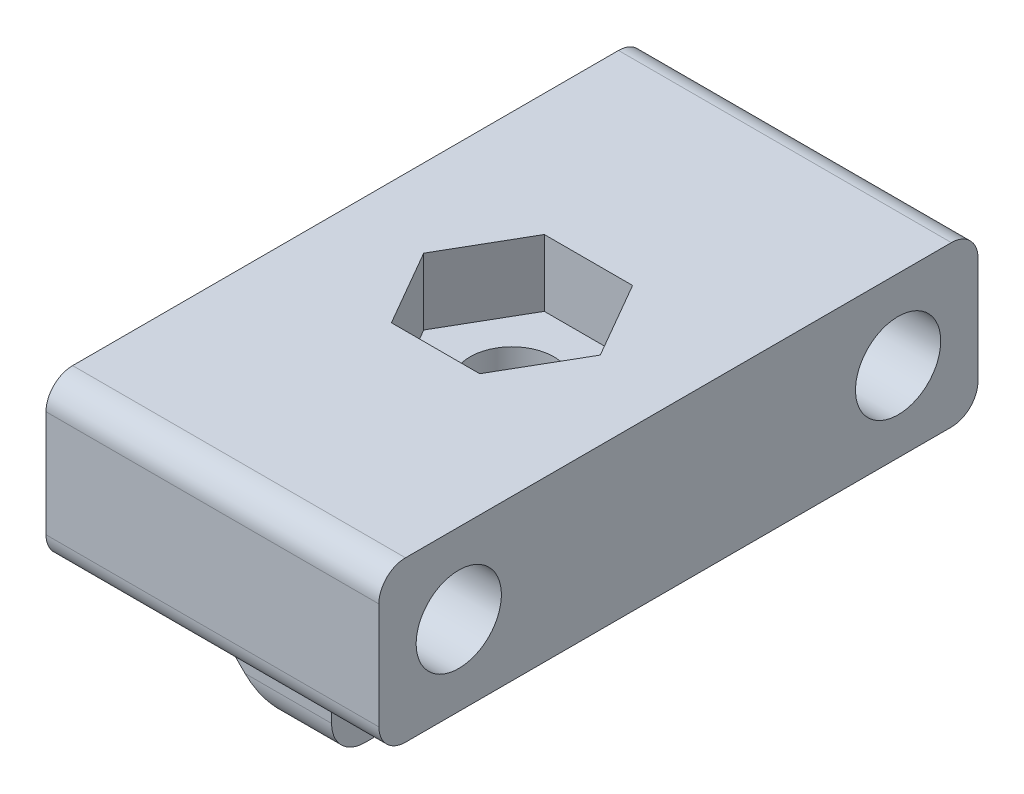
ISO-10303-21;
HEADER;
FILE_DESCRIPTION(('STEP AP214'),'2;1');
FILE_NAME('part.step','',(''),(''),'','','');
FILE_SCHEMA(('AUTOMOTIVE_DESIGN { 1 0 10303 214 1 1 1 1 }'));
ENDSEC;
DATA;
#1=APPLICATION_CONTEXT('core data for automotive mechanical design processes');
#2=APPLICATION_PROTOCOL_DEFINITION('international standard','automotive_design',2000,#1);
#3=PRODUCT_CONTEXT('',#1,'mechanical');
#4=PRODUCT('Part','Part','',(#3));
#5=PRODUCT_RELATED_PRODUCT_CATEGORY('part','',(#4));
#6=PRODUCT_DEFINITION_FORMATION('','',#4);
#7=PRODUCT_DEFINITION_CONTEXT('part definition',#1,'design');
#8=PRODUCT_DEFINITION('design','',#6,#7);
#9=PRODUCT_DEFINITION_SHAPE('','',#8);
#10=(LENGTH_UNIT() NAMED_UNIT(*) SI_UNIT(.MILLI.,.METRE.));
#11=(NAMED_UNIT(*) PLANE_ANGLE_UNIT() SI_UNIT($,.RADIAN.));
#12=(NAMED_UNIT(*) SI_UNIT($,.STERADIAN.) SOLID_ANGLE_UNIT());
#13=UNCERTAINTY_MEASURE_WITH_UNIT(LENGTH_MEASURE(1.E-05),#10,'distance_accuracy_value','');
#14=(GEOMETRIC_REPRESENTATION_CONTEXT(3) GLOBAL_UNCERTAINTY_ASSIGNED_CONTEXT((#13)) GLOBAL_UNIT_ASSIGNED_CONTEXT((#10,
#11,#12)) REPRESENTATION_CONTEXT('',''));
#15=CARTESIAN_POINT('',(0.,0.,0.));
#16=DIRECTION('',(0.,0.,1.));
#17=DIRECTION('',(1.,0.,0.));
#18=AXIS2_PLACEMENT_3D('',#15,#16,#17);
#19=CARTESIAN_POINT('',(0.,0.,0.));
#20=DIRECTION('',(0.,1.,0.));
#21=DIRECTION('',(0.,0.,1.));
#22=AXIS2_PLACEMENT_3D('',#19,#20,#21);
#23=PLANE('',#22);
#24=DIRECTION('',(0.,0.,-1.));
#25=VECTOR('',#24,1.);
#26=CARTESIAN_POINT('',(12.5,0.,22.5));
#27=LINE('',#26,#25);
#28=CARTESIAN_POINT('',(12.5,0.,20.5));
#29=VERTEX_POINT('',#28);
#30=CARTESIAN_POINT('',(12.5,0.,-20.5));
#31=VERTEX_POINT('',#30);
#32=EDGE_CURVE('E352',#29,#31,#27,.T.);
#33=ORIENTED_EDGE('',*,*,#32,.F.);
#34=DIRECTION('',(1.,0.,0.));
#35=VECTOR('',#34,1.);
#36=CARTESIAN_POINT('',(0.,0.,20.5));
#37=LINE('',#36,#35);
#38=CARTESIAN_POINT('',(-12.5,0.,20.5));
#39=VERTEX_POINT('',#38);
#40=EDGE_CURVE('E400',#29,#39,#37,.F.);
#41=ORIENTED_EDGE('',*,*,#40,.T.);
#42=DIRECTION('',(0.,0.,1.));
#43=VECTOR('',#42,1.);
#44=CARTESIAN_POINT('',(-12.5,0.,22.5));
#45=LINE('',#44,#43);
#46=CARTESIAN_POINT('',(-12.5,0.,-20.5));
#47=VERTEX_POINT('',#46);
#48=EDGE_CURVE('E337',#47,#39,#45,.T.);
#49=ORIENTED_EDGE('',*,*,#48,.F.);
#50=DIRECTION('',(-1.,0.,0.));
#51=VECTOR('',#50,1.);
#52=CARTESIAN_POINT('',(0.,0.,-20.5));
#53=LINE('',#52,#51);
#54=EDGE_CURVE('E398',#47,#31,#53,.F.);
#55=ORIENTED_EDGE('',*,*,#54,.T.);
#56=EDGE_LOOP('',(#33,#41,#49,#55));
#57=FACE_BOUND('',#56,.T.);
#58=DIRECTION('',(0.,0.,1.));
#59=VECTOR('',#58,1.);
#60=CARTESIAN_POINT('',(4.99999999999996,0.,18.5499398129865));
#61=LINE('',#60,#59);
#62=CARTESIAN_POINT('',(4.99999999999996,0.,-19.5499398129865));
#63=VERTEX_POINT('',#62);
#64=CARTESIAN_POINT('',(4.99999999999996,0.,19.5499398129865));
#65=VERTEX_POINT('',#64);
#66=EDGE_CURVE('E271',#63,#65,#61,.T.);
#67=ORIENTED_EDGE('',*,*,#66,.F.);
#68=DIRECTION('',(1.,0.,0.));
#69=VECTOR('',#68,1.);
#70=CARTESIAN_POINT('',(-4.99999999999996,0.,-19.5499398129865));
#71=LINE('',#70,#69);
#72=CARTESIAN_POINT('',(-4.99999999999996,0.,-19.5499398129865));
#73=VERTEX_POINT('',#72);
#74=EDGE_CURVE('E253',#63,#73,#71,.F.);
#75=ORIENTED_EDGE('',*,*,#74,.T.);
#76=DIRECTION('',(0.,0.,-1.));
#77=VECTOR('',#76,1.);
#78=CARTESIAN_POINT('',(-4.99999999999996,0.,18.5499398129865));
#79=LINE('',#78,#77);
#80=CARTESIAN_POINT('',(-4.99999999999996,0.,19.5499398129865));
#81=VERTEX_POINT('',#80);
#82=EDGE_CURVE('E212',#81,#73,#79,.T.);
#83=ORIENTED_EDGE('',*,*,#82,.F.);
#84=DIRECTION('',(-1.,0.,0.));
#85=VECTOR('',#84,1.);
#86=CARTESIAN_POINT('',(4.99999999999996,0.,19.5499398129865));
#87=LINE('',#86,#85);
#88=EDGE_CURVE('E250',#81,#65,#87,.F.);
#89=ORIENTED_EDGE('',*,*,#88,.T.);
#90=EDGE_LOOP('',(#67,#75,#83,#89));
#91=FACE_BOUND('',#90,.T.);
#92=ADVANCED_FACE('F49',(#57,#91),#23,.F.);
#93=CARTESIAN_POINT('',(-12.5,12.,22.5));
#94=DIRECTION('',(1.,0.,0.));
#95=DIRECTION('',(0.,0.,-1.));
#96=AXIS2_PLACEMENT_3D('',#93,#94,#95);
#97=PLANE('',#96);
#98=CARTESIAN_POINT('',(-12.5,6.,-16.5));
#99=DIRECTION('',(1.,0.,0.));
#100=DIRECTION('',(0.,0.,-1.));
#101=AXIS2_PLACEMENT_3D('',#98,#99,#100);
#102=CIRCLE('',#101,3.2);
#103=CARTESIAN_POINT('',(-12.5,6.,-19.7));
#104=VERTEX_POINT('',#103);
#105=EDGE_CURVE('E284',#104,#104,#102,.T.);
#106=ORIENTED_EDGE('',*,*,#105,.T.);
#107=EDGE_LOOP('',(#106));
#108=FACE_BOUND('',#107,.T.);
#109=CARTESIAN_POINT('',(-12.5,6.,16.5));
#110=DIRECTION('',(-1.,0.,0.));
#111=DIRECTION('',(0.,0.,1.));
#112=AXIS2_PLACEMENT_3D('',#109,#110,#111);
#113=CIRCLE('',#112,3.2);
#114=CARTESIAN_POINT('',(-12.5,6.,19.7));
#115=VERTEX_POINT('',#114);
#116=EDGE_CURVE('E288',#115,#115,#113,.T.);
#117=ORIENTED_EDGE('',*,*,#116,.F.);
#118=EDGE_LOOP('',(#117));
#119=FACE_BOUND('',#118,.T.);
#120=DIRECTION('',(0.,-1.,0.));
#121=VECTOR('',#120,1.);
#122=CARTESIAN_POINT('',(-12.5,12.,22.5));
#123=LINE('',#122,#121);
#124=CARTESIAN_POINT('',(-12.5,10.,22.5));
#125=VERTEX_POINT('',#124);
#126=CARTESIAN_POINT('',(-12.5,2.,22.5));
#127=VERTEX_POINT('',#126);
#128=EDGE_CURVE('E368',#125,#127,#123,.T.);
#129=ORIENTED_EDGE('',*,*,#128,.F.);
#130=CARTESIAN_POINT('',(-12.5,10.,20.5));
#131=DIRECTION('',(1.,0.,0.));
#132=DIRECTION('',(0.,0.,-1.));
#133=AXIS2_PLACEMENT_3D('',#130,#131,#132);
#134=CIRCLE('',#133,2.);
#135=CARTESIAN_POINT('',(-12.5,12.,20.5));
#136=VERTEX_POINT('',#135);
#137=EDGE_CURVE('E396',#125,#136,#134,.F.);
#138=ORIENTED_EDGE('',*,*,#137,.T.);
#139=DIRECTION('',(0.,0.,1.));
#140=VECTOR('',#139,1.);
#141=CARTESIAN_POINT('',(-12.5,12.,22.5));
#142=LINE('',#141,#140);
#143=CARTESIAN_POINT('',(-12.5,12.,-20.5));
#144=VERTEX_POINT('',#143);
#145=EDGE_CURVE('E348',#144,#136,#142,.T.);
#146=ORIENTED_EDGE('',*,*,#145,.F.);
#147=CARTESIAN_POINT('',(-12.5,10.,-20.5));
#148=DIRECTION('',(1.,0.,0.));
#149=DIRECTION('',(0.,0.,-1.));
#150=AXIS2_PLACEMENT_3D('',#147,#148,#149);
#151=CIRCLE('',#150,2.);
#152=CARTESIAN_POINT('',(-12.5,10.,-22.5));
#153=VERTEX_POINT('',#152);
#154=EDGE_CURVE('E390',#144,#153,#151,.F.);
#155=ORIENTED_EDGE('',*,*,#154,.T.);
#156=DIRECTION('',(0.,-1.,0.));
#157=VECTOR('',#156,1.);
#158=CARTESIAN_POINT('',(-12.5,12.,-22.5));
#159=LINE('',#158,#157);
#160=CARTESIAN_POINT('',(-12.5,2.,-22.5));
#161=VERTEX_POINT('',#160);
#162=EDGE_CURVE('E355',#153,#161,#159,.T.);
#163=ORIENTED_EDGE('',*,*,#162,.T.);
#164=CARTESIAN_POINT('',(-12.5,2.,-20.5));
#165=DIRECTION('',(1.,0.,0.));
#166=DIRECTION('',(0.,0.,-1.));
#167=AXIS2_PLACEMENT_3D('',#164,#165,#166);
#168=CIRCLE('',#167,2.);
#169=EDGE_CURVE('E392',#161,#47,#168,.F.);
#170=ORIENTED_EDGE('',*,*,#169,.T.);
#171=ORIENTED_EDGE('',*,*,#48,.T.);
#172=CARTESIAN_POINT('',(-12.5,2.,20.5));
#173=DIRECTION('',(1.,0.,0.));
#174=DIRECTION('',(0.,0.,-1.));
#175=AXIS2_PLACEMENT_3D('',#172,#173,#174);
#176=CIRCLE('',#175,2.);
#177=EDGE_CURVE('E394',#39,#127,#176,.F.);
#178=ORIENTED_EDGE('',*,*,#177,.T.);
#179=EDGE_LOOP('',(#129,#138,#146,#155,#163,#170,#171,#178));
#180=FACE_BOUND('',#179,.T.);
#181=ADVANCED_FACE('F421',(#108,#119,#180),#97,.F.);
#182=CARTESIAN_POINT('',(12.5,12.,22.5));
#183=DIRECTION('',(0.,0.,-1.));
#184=DIRECTION('',(-1.,0.,0.));
#185=AXIS2_PLACEMENT_3D('',#182,#183,#184);
#186=PLANE('',#185);
#187=DIRECTION('',(0.,-1.,0.));
#188=VECTOR('',#187,1.);
#189=CARTESIAN_POINT('',(12.5,12.,22.5));
#190=LINE('',#189,#188);
#191=CARTESIAN_POINT('',(12.5,10.,22.5));
#192=VERTEX_POINT('',#191);
#193=CARTESIAN_POINT('',(12.5,2.,22.5));
#194=VERTEX_POINT('',#193);
#195=EDGE_CURVE('E365',#192,#194,#190,.T.);
#196=ORIENTED_EDGE('',*,*,#195,.F.);
#197=DIRECTION('',(1.,0.,0.));
#198=VECTOR('',#197,1.);
#199=CARTESIAN_POINT('',(-12.5,10.,22.5));
#200=LINE('',#199,#198);
#201=EDGE_CURVE('E388',#192,#125,#200,.F.);
#202=ORIENTED_EDGE('',*,*,#201,.T.);
#203=ORIENTED_EDGE('',*,*,#128,.T.);
#204=DIRECTION('',(1.,0.,0.));
#205=VECTOR('',#204,1.);
#206=CARTESIAN_POINT('',(12.5,2.,22.5));
#207=LINE('',#206,#205);
#208=EDGE_CURVE('E385',#127,#194,#207,.T.);
#209=ORIENTED_EDGE('',*,*,#208,.T.);
#210=EDGE_LOOP('',(#196,#202,#203,#209));
#211=FACE_BOUND('',#210,.T.);
#212=ADVANCED_FACE('F428',(#211),#186,.F.);
#213=CARTESIAN_POINT('',(12.5,12.,22.5));
#214=DIRECTION('',(-1.,0.,0.));
#215=DIRECTION('',(0.,0.,1.));
#216=AXIS2_PLACEMENT_3D('',#213,#214,#215);
#217=PLANE('',#216);
#218=CARTESIAN_POINT('',(12.5,6.,-16.5));
#219=DIRECTION('',(1.,0.,0.));
#220=DIRECTION('',(0.,0.,-1.));
#221=AXIS2_PLACEMENT_3D('',#218,#219,#220);
#222=CIRCLE('',#221,3.2);
#223=CARTESIAN_POINT('',(12.5,6.,-19.7));
#224=VERTEX_POINT('',#223);
#225=EDGE_CURVE('E285',#224,#224,#222,.T.);
#226=ORIENTED_EDGE('',*,*,#225,.F.);
#227=EDGE_LOOP('',(#226));
#228=FACE_BOUND('',#227,.T.);
#229=CARTESIAN_POINT('',(12.5,6.,16.5));
#230=DIRECTION('',(-1.,0.,0.));
#231=DIRECTION('',(0.,0.,1.));
#232=AXIS2_PLACEMENT_3D('',#229,#230,#231);
#233=CIRCLE('',#232,3.2);
#234=CARTESIAN_POINT('',(12.5,6.,19.7));
#235=VERTEX_POINT('',#234);
#236=EDGE_CURVE('E291',#235,#235,#233,.T.);
#237=ORIENTED_EDGE('',*,*,#236,.T.);
#238=EDGE_LOOP('',(#237));
#239=FACE_BOUND('',#238,.T.);
#240=DIRECTION('',(0.,0.,-1.));
#241=VECTOR('',#240,1.);
#242=CARTESIAN_POINT('',(12.5,12.,22.5));
#243=LINE('',#242,#241);
#244=CARTESIAN_POINT('',(12.5,12.,20.5));
#245=VERTEX_POINT('',#244);
#246=CARTESIAN_POINT('',(12.5,12.,-20.5));
#247=VERTEX_POINT('',#246);
#248=EDGE_CURVE('E351',#245,#247,#243,.T.);
#249=ORIENTED_EDGE('',*,*,#248,.F.);
#250=CARTESIAN_POINT('',(12.5,10.,20.5));
#251=DIRECTION('',(-1.,0.,0.));
#252=DIRECTION('',(0.,0.,1.));
#253=AXIS2_PLACEMENT_3D('',#250,#251,#252);
#254=CIRCLE('',#253,2.);
#255=EDGE_CURVE('E383',#245,#192,#254,.F.);
#256=ORIENTED_EDGE('',*,*,#255,.T.);
#257=ORIENTED_EDGE('',*,*,#195,.T.);
#258=CARTESIAN_POINT('',(12.5,2.,20.5));
#259=DIRECTION('',(-1.,0.,0.));
#260=DIRECTION('',(0.,0.,1.));
#261=AXIS2_PLACEMENT_3D('',#258,#259,#260);
#262=CIRCLE('',#261,2.);
#263=EDGE_CURVE('E381',#194,#29,#262,.F.);
#264=ORIENTED_EDGE('',*,*,#263,.T.);
#265=ORIENTED_EDGE('',*,*,#32,.T.);
#266=CARTESIAN_POINT('',(12.5,2.,-20.5));
#267=DIRECTION('',(-1.,0.,0.));
#268=DIRECTION('',(0.,0.,1.));
#269=AXIS2_PLACEMENT_3D('',#266,#267,#268);
#270=CIRCLE('',#269,2.);
#271=CARTESIAN_POINT('',(12.5,2.,-22.5));
#272=VERTEX_POINT('',#271);
#273=EDGE_CURVE('E379',#31,#272,#270,.F.);
#274=ORIENTED_EDGE('',*,*,#273,.T.);
#275=DIRECTION('',(0.,-1.,0.));
#276=VECTOR('',#275,1.);
#277=CARTESIAN_POINT('',(12.5,12.,-22.5));
#278=LINE('',#277,#276);
#279=CARTESIAN_POINT('',(12.5,10.,-22.5));
#280=VERTEX_POINT('',#279);
#281=EDGE_CURVE('E362',#280,#272,#278,.T.);
#282=ORIENTED_EDGE('',*,*,#281,.F.);
#283=CARTESIAN_POINT('',(12.5,10.,-20.5));
#284=DIRECTION('',(-1.,0.,0.));
#285=DIRECTION('',(0.,0.,1.));
#286=AXIS2_PLACEMENT_3D('',#283,#284,#285);
#287=CIRCLE('',#286,2.);
#288=EDGE_CURVE('E377',#280,#247,#287,.F.);
#289=ORIENTED_EDGE('',*,*,#288,.T.);
#290=EDGE_LOOP('',(#249,#256,#257,#264,#265,#274,#282,#289));
#291=FACE_BOUND('',#290,.T.);
#292=ADVANCED_FACE('F411',(#228,#239,#291),#217,.F.);
#293=CARTESIAN_POINT('',(12.5,12.,-22.5));
#294=DIRECTION('',(0.,0.,1.));
#295=DIRECTION('',(1.,0.,0.));
#296=AXIS2_PLACEMENT_3D('',#293,#294,#295);
#297=PLANE('',#296);
#298=ORIENTED_EDGE('',*,*,#281,.T.);
#299=DIRECTION('',(-1.,0.,0.));
#300=VECTOR('',#299,1.);
#301=CARTESIAN_POINT('',(12.5,2.,-22.5));
#302=LINE('',#301,#300);
#303=EDGE_CURVE('E219',#272,#161,#302,.T.);
#304=ORIENTED_EDGE('',*,*,#303,.T.);
#305=ORIENTED_EDGE('',*,*,#162,.F.);
#306=DIRECTION('',(-1.,0.,0.));
#307=VECTOR('',#306,1.);
#308=CARTESIAN_POINT('',(12.5,10.,-22.5));
#309=LINE('',#308,#307);
#310=EDGE_CURVE('E223',#153,#280,#309,.F.);
#311=ORIENTED_EDGE('',*,*,#310,.T.);
#312=EDGE_LOOP('',(#298,#304,#305,#311));
#313=FACE_BOUND('',#312,.T.);
#314=ADVANCED_FACE('F405',(#313),#297,.F.);
#315=CARTESIAN_POINT('',(0.,12.,0.));
#316=DIRECTION('',(0.,1.,0.));
#317=DIRECTION('',(0.,0.,1.));
#318=AXIS2_PLACEMENT_3D('',#315,#316,#317);
#319=PLANE('',#318);
#320=DIRECTION('',(1.,0.,0.));
#321=VECTOR('',#320,1.);
#322=CARTESIAN_POINT('',(-3.315,12.,5.74174842709083));
#323=LINE('',#322,#321);
#324=CARTESIAN_POINT('',(-3.315,12.,5.74174842709083));
#325=VERTEX_POINT('',#324);
#326=CARTESIAN_POINT('',(3.31500000000001,12.,5.74174842709083));
#327=VERTEX_POINT('',#326);
#328=EDGE_CURVE('E299',#325,#327,#323,.T.);
#329=ORIENTED_EDGE('',*,*,#328,.F.);
#330=DIRECTION('',(0.500000000000001,0.,0.866025403784439));
#331=VECTOR('',#330,1.);
#332=CARTESIAN_POINT('',(-6.63,12.,0.));
#333=LINE('',#332,#331);
#334=CARTESIAN_POINT('',(-6.63,12.,0.));
#335=VERTEX_POINT('',#334);
#336=EDGE_CURVE('E304',#335,#325,#333,.T.);
#337=ORIENTED_EDGE('',*,*,#336,.F.);
#338=DIRECTION('',(-0.5,0.,0.866025403784439));
#339=VECTOR('',#338,1.);
#340=CARTESIAN_POINT('',(-3.31500000000001,12.,-5.74174842709082));
#341=LINE('',#340,#339);
#342=CARTESIAN_POINT('',(-3.31500000000001,12.,-5.74174842709082));
#343=VERTEX_POINT('',#342);
#344=EDGE_CURVE('E330',#343,#335,#341,.T.);
#345=ORIENTED_EDGE('',*,*,#344,.F.);
#346=DIRECTION('',(-1.,0.,0.));
#347=VECTOR('',#346,1.);
#348=CARTESIAN_POINT('',(3.315,12.,-5.74174842709082));
#349=LINE('',#348,#347);
#350=CARTESIAN_POINT('',(3.315,12.,-5.74174842709082));
#351=VERTEX_POINT('',#350);
#352=EDGE_CURVE('E327',#351,#343,#349,.T.);
#353=ORIENTED_EDGE('',*,*,#352,.F.);
#354=DIRECTION('',(-0.5,0.,-0.866025403784439));
#355=VECTOR('',#354,1.);
#356=CARTESIAN_POINT('',(6.63,12.,0.));
#357=LINE('',#356,#355);
#358=CARTESIAN_POINT('',(6.63,12.,0.));
#359=VERTEX_POINT('',#358);
#360=EDGE_CURVE('E324',#359,#351,#357,.T.);
#361=ORIENTED_EDGE('',*,*,#360,.F.);
#362=DIRECTION('',(0.500000000000001,0.,-0.866025403784439));
#363=VECTOR('',#362,1.);
#364=CARTESIAN_POINT('',(3.31500000000001,12.,5.74174842709083));
#365=LINE('',#364,#363);
#366=EDGE_CURVE('E321',#327,#359,#365,.T.);
#367=ORIENTED_EDGE('',*,*,#366,.F.);
#368=EDGE_LOOP('',(#329,#337,#345,#353,#361,#367));
#369=FACE_BOUND('',#368,.T.);
#370=ORIENTED_EDGE('',*,*,#145,.T.);
#371=DIRECTION('',(1.,0.,0.));
#372=VECTOR('',#371,1.);
#373=CARTESIAN_POINT('',(12.5,12.,20.5));
#374=LINE('',#373,#372);
#375=EDGE_CURVE('E374',#136,#245,#374,.T.);
#376=ORIENTED_EDGE('',*,*,#375,.T.);
#377=ORIENTED_EDGE('',*,*,#248,.T.);
#378=DIRECTION('',(-1.,0.,0.));
#379=VECTOR('',#378,1.);
#380=CARTESIAN_POINT('',(-12.5,12.,-20.5));
#381=LINE('',#380,#379);
#382=EDGE_CURVE('E371',#247,#144,#381,.T.);
#383=ORIENTED_EDGE('',*,*,#382,.T.);
#384=EDGE_LOOP('',(#370,#376,#377,#383));
#385=FACE_BOUND('',#384,.T.);
#386=ADVANCED_FACE('F417',(#369,#385),#319,.T.);
#387=CARTESIAN_POINT('',(-3.315,7.,5.74174842709083));
#388=DIRECTION('',(0.,0.,1.));
#389=DIRECTION('',(1.,0.,0.));
#390=AXIS2_PLACEMENT_3D('',#387,#388,#389);
#391=PLANE('',#390);
#392=ORIENTED_EDGE('',*,*,#328,.T.);
#393=DIRECTION('',(0.,1.,0.));
#394=VECTOR('',#393,1.);
#395=CARTESIAN_POINT('',(3.315,7.,5.74174842709083));
#396=LINE('',#395,#394);
#397=CARTESIAN_POINT('',(3.315,7.,5.74174842709083));
#398=VERTEX_POINT('',#397);
#399=EDGE_CURVE('E319',#398,#327,#396,.T.);
#400=ORIENTED_EDGE('',*,*,#399,.F.);
#401=DIRECTION('',(1.,0.,0.));
#402=VECTOR('',#401,1.);
#403=CARTESIAN_POINT('',(-3.315,7.,5.74174842709083));
#404=LINE('',#403,#402);
#405=CARTESIAN_POINT('',(-3.315,7.,5.74174842709083));
#406=VERTEX_POINT('',#405);
#407=EDGE_CURVE('E300',#406,#398,#404,.T.);
#408=ORIENTED_EDGE('',*,*,#407,.F.);
#409=DIRECTION('',(0.,1.,0.));
#410=VECTOR('',#409,1.);
#411=CARTESIAN_POINT('',(-3.315,7.,5.74174842709083));
#412=LINE('',#411,#410);
#413=EDGE_CURVE('E335',#406,#325,#412,.T.);
#414=ORIENTED_EDGE('',*,*,#413,.T.);
#415=EDGE_LOOP('',(#392,#400,#408,#414));
#416=FACE_BOUND('',#415,.T.);
#417=ADVANCED_FACE('F497',(#416),#391,.F.);
#418=CARTESIAN_POINT('',(-6.63,7.,0.));
#419=DIRECTION('',(-0.866025403784439,0.,0.5));
#420=DIRECTION('',(0.5,0.,0.866025403784438));
#421=AXIS2_PLACEMENT_3D('',#418,#419,#420);
#422=PLANE('',#421);
#423=ORIENTED_EDGE('',*,*,#336,.T.);
#424=ORIENTED_EDGE('',*,*,#413,.F.);
#425=DIRECTION('',(0.500000000000001,0.,0.866025403784439));
#426=VECTOR('',#425,1.);
#427=CARTESIAN_POINT('',(-6.63,7.,0.));
#428=LINE('',#427,#426);
#429=CARTESIAN_POINT('',(-6.63,7.,0.));
#430=VERTEX_POINT('',#429);
#431=EDGE_CURVE('E316',#430,#406,#428,.T.);
#432=ORIENTED_EDGE('',*,*,#431,.F.);
#433=DIRECTION('',(0.,1.,0.));
#434=VECTOR('',#433,1.);
#435=CARTESIAN_POINT('',(-6.63,7.,0.));
#436=LINE('',#435,#434);
#437=EDGE_CURVE('E338',#430,#335,#436,.T.);
#438=ORIENTED_EDGE('',*,*,#437,.T.);
#439=EDGE_LOOP('',(#423,#424,#432,#438));
#440=FACE_BOUND('',#439,.T.);
#441=ADVANCED_FACE('F493',(#440),#422,.F.);
#442=CARTESIAN_POINT('',(-3.31500000000001,7.,-5.74174842709082));
#443=DIRECTION('',(-0.866025403784439,0.,-0.5));
#444=DIRECTION('',(-0.5,0.,0.866025403784439));
#445=AXIS2_PLACEMENT_3D('',#442,#443,#444);
#446=PLANE('',#445);
#447=ORIENTED_EDGE('',*,*,#344,.T.);
#448=ORIENTED_EDGE('',*,*,#437,.F.);
#449=DIRECTION('',(-0.5,0.,0.866025403784439));
#450=VECTOR('',#449,1.);
#451=CARTESIAN_POINT('',(-3.31500000000001,7.,-5.74174842709082));
#452=LINE('',#451,#450);
#453=CARTESIAN_POINT('',(-3.31500000000001,7.,-5.74174842709082));
#454=VERTEX_POINT('',#453);
#455=EDGE_CURVE('E313',#454,#430,#452,.T.);
#456=ORIENTED_EDGE('',*,*,#455,.F.);
#457=DIRECTION('',(0.,1.,0.));
#458=VECTOR('',#457,1.);
#459=CARTESIAN_POINT('',(-3.31500000000001,7.,-5.74174842709082));
#460=LINE('',#459,#458);
#461=EDGE_CURVE('E340',#454,#343,#460,.T.);
#462=ORIENTED_EDGE('',*,*,#461,.T.);
#463=EDGE_LOOP('',(#447,#448,#456,#462));
#464=FACE_BOUND('',#463,.T.);
#465=ADVANCED_FACE('F496',(#464),#446,.F.);
#466=CARTESIAN_POINT('',(3.315,7.,-5.74174842709082));
#467=DIRECTION('',(0.,0.,-1.));
#468=DIRECTION('',(-1.,0.,0.));
#469=AXIS2_PLACEMENT_3D('',#466,#467,#468);
#470=PLANE('',#469);
#471=ORIENTED_EDGE('',*,*,#352,.T.);
#472=ORIENTED_EDGE('',*,*,#461,.F.);
#473=DIRECTION('',(-1.,0.,0.));
#474=VECTOR('',#473,1.);
#475=CARTESIAN_POINT('',(3.315,7.,-5.74174842709082));
#476=LINE('',#475,#474);
#477=CARTESIAN_POINT('',(3.315,7.,-5.74174842709082));
#478=VERTEX_POINT('',#477);
#479=EDGE_CURVE('E310',#478,#454,#476,.T.);
#480=ORIENTED_EDGE('',*,*,#479,.F.);
#481=DIRECTION('',(0.,1.,0.));
#482=VECTOR('',#481,1.);
#483=CARTESIAN_POINT('',(3.315,7.,-5.74174842709082));
#484=LINE('',#483,#482);
#485=EDGE_CURVE('E342',#478,#351,#484,.T.);
#486=ORIENTED_EDGE('',*,*,#485,.T.);
#487=EDGE_LOOP('',(#471,#472,#480,#486));
#488=FACE_BOUND('',#487,.T.);
#489=ADVANCED_FACE('F501',(#488),#470,.F.);
#490=CARTESIAN_POINT('',(6.63,7.00000000000001,0.));
#491=DIRECTION('',(0.866025403784439,0.,-0.5));
#492=DIRECTION('',(-0.5,0.,-0.866025403784439));
#493=AXIS2_PLACEMENT_3D('',#490,#491,#492);
#494=PLANE('',#493);
#495=ORIENTED_EDGE('',*,*,#360,.T.);
#496=ORIENTED_EDGE('',*,*,#485,.F.);
#497=DIRECTION('',(-0.5,0.,-0.866025403784439));
#498=VECTOR('',#497,1.);
#499=CARTESIAN_POINT('',(6.63,7.00000000000001,0.));
#500=LINE('',#499,#498);
#501=CARTESIAN_POINT('',(6.63,7.00000000000001,0.));
#502=VERTEX_POINT('',#501);
#503=EDGE_CURVE('E307',#502,#478,#500,.T.);
#504=ORIENTED_EDGE('',*,*,#503,.F.);
#505=DIRECTION('',(0.,1.,0.));
#506=VECTOR('',#505,1.);
#507=CARTESIAN_POINT('',(6.63,7.00000000000001,0.));
#508=LINE('',#507,#506);
#509=EDGE_CURVE('E344',#502,#359,#508,.T.);
#510=ORIENTED_EDGE('',*,*,#509,.T.);
#511=EDGE_LOOP('',(#495,#496,#504,#510));
#512=FACE_BOUND('',#511,.T.);
#513=ADVANCED_FACE('F505',(#512),#494,.F.);
#514=CARTESIAN_POINT('',(3.315,7.,5.74174842709083));
#515=DIRECTION('',(0.866025403784439,0.,0.5));
#516=DIRECTION('',(0.5,0.,-0.866025403784438));
#517=AXIS2_PLACEMENT_3D('',#514,#515,#516);
#518=PLANE('',#517);
#519=ORIENTED_EDGE('',*,*,#366,.T.);
#520=ORIENTED_EDGE('',*,*,#509,.F.);
#521=DIRECTION('',(0.500000000000001,0.,-0.866025403784439));
#522=VECTOR('',#521,1.);
#523=CARTESIAN_POINT('',(3.315,7.,5.74174842709083));
#524=LINE('',#523,#522);
#525=EDGE_CURVE('E303',#398,#502,#524,.T.);
#526=ORIENTED_EDGE('',*,*,#525,.F.);
#527=ORIENTED_EDGE('',*,*,#399,.T.);
#528=EDGE_LOOP('',(#519,#520,#526,#527));
#529=FACE_BOUND('',#528,.T.);
#530=ADVANCED_FACE('F491',(#529),#518,.F.);
#531=CARTESIAN_POINT('',(0.,7.,0.));
#532=DIRECTION('',(0.,1.,0.));
#533=DIRECTION('',(0.,0.,1.));
#534=AXIS2_PLACEMENT_3D('',#531,#532,#533);
#535=PLANE('',#534);
#536=CARTESIAN_POINT('',(0.,7.,0.));
#537=DIRECTION('',(0.,1.,0.));
#538=DIRECTION('',(0.,0.,1.));
#539=AXIS2_PLACEMENT_3D('',#536,#537,#538);
#540=CIRCLE('',#539,3.15);
#541=CARTESIAN_POINT('',(0.,7.,3.15));
#542=VERTEX_POINT('',#541);
#543=EDGE_CURVE('E294',#542,#542,#540,.T.);
#544=ORIENTED_EDGE('',*,*,#543,.F.);
#545=EDGE_LOOP('',(#544));
#546=FACE_BOUND('',#545,.T.);
#547=ORIENTED_EDGE('',*,*,#407,.T.);
#548=ORIENTED_EDGE('',*,*,#525,.T.);
#549=ORIENTED_EDGE('',*,*,#503,.T.);
#550=ORIENTED_EDGE('',*,*,#479,.T.);
#551=ORIENTED_EDGE('',*,*,#455,.T.);
#552=ORIENTED_EDGE('',*,*,#431,.T.);
#553=EDGE_LOOP('',(#547,#548,#549,#550,#551,#552));
#554=FACE_BOUND('',#553,.T.);
#555=ADVANCED_FACE('F487',(#546,#554),#535,.T.);
#556=CARTESIAN_POINT('',(0.,0.,0.));
#557=DIRECTION('',(0.,1.,0.));
#558=DIRECTION('',(0.,0.,1.));
#559=AXIS2_PLACEMENT_3D('',#556,#557,#558);
#560=CYLINDRICAL_SURFACE('',#559,3.15);
#561=ORIENTED_EDGE('',*,*,#543,.T.);
#562=EDGE_LOOP('',(#561));
#563=FACE_BOUND('',#562,.T.);
#564=CARTESIAN_POINT('',(0.,-4.99999999999997,0.));
#565=DIRECTION('',(0.707106781186549,0.707106781186546,0.));
#566=DIRECTION('',(-0.707106781186546,0.707106781186549,0.));
#567=AXIS2_PLACEMENT_3D('',#564,#565,#566);
#568=ELLIPSE('',#567,4.45477272147526,3.15);
#569=CARTESIAN_POINT('',(1.00000000000003,-6.,2.98705540624876));
#570=VERTEX_POINT('',#569);
#571=CARTESIAN_POINT('',(1.00000000000003,-6.,-2.98705540624876));
#572=VERTEX_POINT('',#571);
#573=EDGE_CURVE('E13',#570,#572,#568,.F.);
#574=ORIENTED_EDGE('',*,*,#573,.T.);
#575=CARTESIAN_POINT('',(0.,-6.,0.));
#576=DIRECTION('',(0.,1.,0.));
#577=DIRECTION('',(0.,0.,1.));
#578=AXIS2_PLACEMENT_3D('',#575,#576,#577);
#579=CIRCLE('',#578,3.15);
#580=EDGE_CURVE('E62',#570,#572,#579,.T.);
#581=ORIENTED_EDGE('',*,*,#580,.F.);
#582=EDGE_LOOP('',(#574,#581));
#583=FACE_BOUND('',#582,.T.);
#584=ADVANCED_FACE('F200',(#563,#583),#560,.F.);
#585=CARTESIAN_POINT('',(12.5,6.,16.5));
#586=DIRECTION('',(-1.,0.,0.));
#587=DIRECTION('',(0.,0.,1.));
#588=AXIS2_PLACEMENT_3D('',#585,#586,#587);
#589=CYLINDRICAL_SURFACE('',#588,3.2);
#590=ORIENTED_EDGE('',*,*,#236,.F.);
#591=EDGE_LOOP('',(#590));
#592=FACE_BOUND('',#591,.T.);
#593=ORIENTED_EDGE('',*,*,#116,.T.);
#594=EDGE_LOOP('',(#593));
#595=FACE_BOUND('',#594,.T.);
#596=ADVANCED_FACE('F473',(#592,#595),#589,.F.);
#597=CARTESIAN_POINT('',(12.5,6.,-16.5));
#598=DIRECTION('',(-1.,0.,0.));
#599=DIRECTION('',(0.,0.,1.));
#600=AXIS2_PLACEMENT_3D('',#597,#598,#599);
#601=CYLINDRICAL_SURFACE('',#600,3.2);
#602=ORIENTED_EDGE('',*,*,#225,.T.);
#603=EDGE_LOOP('',(#602));
#604=FACE_BOUND('',#603,.T.);
#605=ORIENTED_EDGE('',*,*,#105,.F.);
#606=EDGE_LOOP('',(#605));
#607=FACE_BOUND('',#606,.T.);
#608=ADVANCED_FACE('F469',(#604,#607),#601,.F.);
#609=CARTESIAN_POINT('',(0.,10.,20.5));
#610=DIRECTION('',(-1.,0.,0.));
#611=DIRECTION('',(0.,0.,1.));
#612=AXIS2_PLACEMENT_3D('',#609,#610,#611);
#613=CYLINDRICAL_SURFACE('',#612,2.);
#614=ORIENTED_EDGE('',*,*,#137,.F.);
#615=ORIENTED_EDGE('',*,*,#201,.F.);
#616=ORIENTED_EDGE('',*,*,#255,.F.);
#617=ORIENTED_EDGE('',*,*,#375,.F.);
#618=EDGE_LOOP('',(#614,#615,#616,#617));
#619=FACE_BOUND('',#618,.T.);
#620=ADVANCED_FACE('F425',(#619),#613,.T.);
#621=CARTESIAN_POINT('',(12.5,2.,20.5));
#622=DIRECTION('',(1.,0.,0.));
#623=DIRECTION('',(0.,0.,-1.));
#624=AXIS2_PLACEMENT_3D('',#621,#622,#623);
#625=CYLINDRICAL_SURFACE('',#624,2.);
#626=ORIENTED_EDGE('',*,*,#177,.F.);
#627=ORIENTED_EDGE('',*,*,#40,.F.);
#628=ORIENTED_EDGE('',*,*,#263,.F.);
#629=ORIENTED_EDGE('',*,*,#208,.F.);
#630=EDGE_LOOP('',(#626,#627,#628,#629));
#631=FACE_BOUND('',#630,.T.);
#632=ADVANCED_FACE('F432',(#631),#625,.T.);
#633=CARTESIAN_POINT('',(12.5,2.,-20.5));
#634=DIRECTION('',(-1.,0.,0.));
#635=DIRECTION('',(0.,0.,1.));
#636=AXIS2_PLACEMENT_3D('',#633,#634,#635);
#637=CYLINDRICAL_SURFACE('',#636,2.);
#638=ORIENTED_EDGE('',*,*,#273,.F.);
#639=ORIENTED_EDGE('',*,*,#54,.F.);
#640=ORIENTED_EDGE('',*,*,#169,.F.);
#641=ORIENTED_EDGE('',*,*,#303,.F.);
#642=EDGE_LOOP('',(#638,#639,#640,#641));
#643=FACE_BOUND('',#642,.T.);
#644=ADVANCED_FACE('F439',(#643),#637,.T.);
#645=CARTESIAN_POINT('',(0.,10.,-20.5));
#646=DIRECTION('',(1.,0.,0.));
#647=DIRECTION('',(0.,0.,-1.));
#648=AXIS2_PLACEMENT_3D('',#645,#646,#647);
#649=CYLINDRICAL_SURFACE('',#648,2.);
#650=ORIENTED_EDGE('',*,*,#288,.F.);
#651=ORIENTED_EDGE('',*,*,#310,.F.);
#652=ORIENTED_EDGE('',*,*,#154,.F.);
#653=ORIENTED_EDGE('',*,*,#382,.F.);
#654=EDGE_LOOP('',(#650,#651,#652,#653));
#655=FACE_BOUND('',#654,.T.);
#656=ADVANCED_FACE('F414',(#655),#649,.T.);
#657=CARTESIAN_POINT('',(4.99999999999996,-6.,-18.5499398129865));
#658=DIRECTION('',(0.,0.,1.));
#659=DIRECTION('',(0.,-1.,0.));
#660=AXIS2_PLACEMENT_3D('',#657,#658,#659);
#661=PLANE('',#660);
#662=DIRECTION('',(0.707106781186546,-0.707106781186549,0.));
#663=VECTOR('',#662,1.);
#664=CARTESIAN_POINT('',(1.00000000000003,-6.,-18.5499398129865));
#665=LINE('',#664,#663);
#666=CARTESIAN_POINT('',(-1.49999999999996,-3.5,-18.5499398129865));
#667=VERTEX_POINT('',#666);
#668=CARTESIAN_POINT('',(-3.99999999999995,-1.,-18.5499398129865));
#669=VERTEX_POINT('',#668);
#670=EDGE_CURVE('E221',#667,#669,#665,.F.);
#671=ORIENTED_EDGE('',*,*,#670,.T.);
#672=DIRECTION('',(1.,0.,0.));
#673=VECTOR('',#672,1.);
#674=CARTESIAN_POINT('',(4.99999999999996,-1.,-18.5499398129865));
#675=LINE('',#674,#673);
#676=CARTESIAN_POINT('',(4.99999999999996,-1.,-18.5499398129865));
#677=VERTEX_POINT('',#676);
#678=EDGE_CURVE('E247',#669,#677,#675,.T.);
#679=ORIENTED_EDGE('',*,*,#678,.T.);
#680=DIRECTION('',(0.,1.,0.));
#681=VECTOR('',#680,1.);
#682=CARTESIAN_POINT('',(4.99999999999996,-6.,-18.5499398129865));
#683=LINE('',#682,#681);
#684=CARTESIAN_POINT('',(4.99999999999996,-3.5,-18.5499398129865));
#685=VERTEX_POINT('',#684);
#686=EDGE_CURVE('E281',#685,#677,#683,.T.);
#687=ORIENTED_EDGE('',*,*,#686,.F.);
#688=DIRECTION('',(1.,0.,0.));
#689=VECTOR('',#688,1.);
#690=CARTESIAN_POINT('',(4.99999999999996,-3.5,-18.5499398129865));
#691=LINE('',#690,#689);
#692=EDGE_CURVE('E239',#685,#667,#691,.F.);
#693=ORIENTED_EDGE('',*,*,#692,.T.);
#694=EDGE_LOOP('',(#671,#679,#687,#693));
#695=FACE_BOUND('',#694,.T.);
#696=ADVANCED_FACE('F446',(#695),#661,.F.);
#697=CARTESIAN_POINT('',(4.99999999999996,-6.,18.5499398129865));
#698=DIRECTION('',(-1.,0.,0.));
#699=DIRECTION('',(0.,-1.,0.));
#700=AXIS2_PLACEMENT_3D('',#697,#698,#699);
#701=PLANE('',#700);
#702=DIRECTION('',(0.,0.,1.));
#703=VECTOR('',#702,1.);
#704=CARTESIAN_POINT('',(4.99999999999996,-6.,18.5499398129865));
#705=LINE('',#704,#703);
#706=CARTESIAN_POINT('',(4.99999999999996,-6.,-16.0499398129865));
#707=VERTEX_POINT('',#706);
#708=CARTESIAN_POINT('',(4.99999999999996,-6.,16.0499398129865));
#709=VERTEX_POINT('',#708);
#710=EDGE_CURVE('E275',#707,#709,#705,.T.);
#711=ORIENTED_EDGE('',*,*,#710,.F.);
#712=CARTESIAN_POINT('',(4.99999999999996,-3.5,-16.0499398129865));
#713=DIRECTION('',(-1.,0.,0.));
#714=DIRECTION('',(0.,-1.,0.));
#715=AXIS2_PLACEMENT_3D('',#712,#713,#714);
#716=CIRCLE('',#715,2.5);
#717=EDGE_CURVE('E237',#707,#685,#716,.F.);
#718=ORIENTED_EDGE('',*,*,#717,.T.);
#719=ORIENTED_EDGE('',*,*,#686,.T.);
#720=CARTESIAN_POINT('',(4.99999999999996,-1.,-19.5499398129865));
#721=DIRECTION('',(-1.,0.,0.));
#722=DIRECTION('',(0.,-1.,0.));
#723=AXIS2_PLACEMENT_3D('',#720,#721,#722);
#724=CIRCLE('',#723,1.);
#725=EDGE_CURVE('E259',#677,#63,#724,.T.);
#726=ORIENTED_EDGE('',*,*,#725,.T.);
#727=ORIENTED_EDGE('',*,*,#66,.T.);
#728=CARTESIAN_POINT('',(4.99999999999996,-0.999999999999999,19.5499398129865));
#729=DIRECTION('',(-1.,0.,0.));
#730=DIRECTION('',(0.,-1.,0.));
#731=AXIS2_PLACEMENT_3D('',#728,#729,#730);
#732=CIRCLE('',#731,1.);
#733=CARTESIAN_POINT('',(4.99999999999996,-0.999999999999999,18.5499398129865));
#734=VERTEX_POINT('',#733);
#735=EDGE_CURVE('E57',#65,#734,#732,.T.);
#736=ORIENTED_EDGE('',*,*,#735,.T.);
#737=DIRECTION('',(0.,1.,0.));
#738=VECTOR('',#737,1.);
#739=CARTESIAN_POINT('',(4.99999999999996,-6.,18.5499398129865));
#740=LINE('',#739,#738);
#741=CARTESIAN_POINT('',(4.99999999999996,-3.5,18.5499398129865));
#742=VERTEX_POINT('',#741);
#743=EDGE_CURVE('E279',#742,#734,#740,.T.);
#744=ORIENTED_EDGE('',*,*,#743,.F.);
#745=CARTESIAN_POINT('',(4.99999999999996,-3.5,16.0499398129865));
#746=DIRECTION('',(-1.,0.,0.));
#747=DIRECTION('',(0.,-1.,0.));
#748=AXIS2_PLACEMENT_3D('',#745,#746,#747);
#749=CIRCLE('',#748,2.5);
#750=EDGE_CURVE('E235',#742,#709,#749,.F.);
#751=ORIENTED_EDGE('',*,*,#750,.T.);
#752=EDGE_LOOP('',(#711,#718,#719,#726,#727,#736,#744,#751));
#753=FACE_BOUND('',#752,.T.);
#754=ADVANCED_FACE('F639',(#753),#701,.F.);
#755=CARTESIAN_POINT('',(4.99999999999996,-6.,18.5499398129865));
#756=DIRECTION('',(0.,0.,-1.));
#757=DIRECTION('',(0.,1.,0.));
#758=AXIS2_PLACEMENT_3D('',#755,#756,#757);
#759=PLANE('',#758);
#760=ORIENTED_EDGE('',*,*,#743,.T.);
#761=DIRECTION('',(-1.,0.,0.));
#762=VECTOR('',#761,1.);
#763=CARTESIAN_POINT('',(-4.99999999999996,-0.999999999999999,18.5499398129865));
#764=LINE('',#763,#762);
#765=CARTESIAN_POINT('',(-3.99999999999995,-0.999999999999999,18.5499398129865));
#766=VERTEX_POINT('',#765);
#767=EDGE_CURVE('E256',#734,#766,#764,.T.);
#768=ORIENTED_EDGE('',*,*,#767,.T.);
#769=DIRECTION('',(-0.707106781186546,0.707106781186549,0.));
#770=VECTOR('',#769,1.);
#771=CARTESIAN_POINT('',(1.00000000000003,-6.,18.5499398129865));
#772=LINE('',#771,#770);
#773=CARTESIAN_POINT('',(-1.49999999999996,-3.5,18.5499398129865));
#774=VERTEX_POINT('',#773);
#775=EDGE_CURVE('E229',#766,#774,#772,.F.);
#776=ORIENTED_EDGE('',*,*,#775,.T.);
#777=DIRECTION('',(-1.,0.,0.));
#778=VECTOR('',#777,1.);
#779=CARTESIAN_POINT('',(4.99999999999996,-3.5,18.5499398129865));
#780=LINE('',#779,#778);
#781=EDGE_CURVE('E245',#774,#742,#780,.F.);
#782=ORIENTED_EDGE('',*,*,#781,.T.);
#783=EDGE_LOOP('',(#760,#768,#776,#782));
#784=FACE_BOUND('',#783,.T.);
#785=ADVANCED_FACE('F647',(#784),#759,.F.);
#786=CARTESIAN_POINT('',(0.,-6.,0.));
#787=DIRECTION('',(0.,1.,0.));
#788=DIRECTION('',(0.,0.,1.));
#789=AXIS2_PLACEMENT_3D('',#786,#787,#788);
#790=PLANE('',#789);
#791=DIRECTION('',(0.,0.,-1.));
#792=VECTOR('',#791,1.);
#793=CARTESIAN_POINT('',(1.00000000000003,-6.,0.));
#794=LINE('',#793,#792);
#795=CARTESIAN_POINT('',(1.00000000000003,-6.,16.0499398129865));
#796=VERTEX_POINT('',#795);
#797=EDGE_CURVE('E211',#796,#570,#794,.T.);
#798=ORIENTED_EDGE('',*,*,#797,.T.);
#799=ORIENTED_EDGE('',*,*,#580,.T.);
#800=CARTESIAN_POINT('',(1.00000000000003,-6.,-16.0499398129865));
#801=VERTEX_POINT('',#800);
#802=EDGE_CURVE('E208',#572,#801,#794,.T.);
#803=ORIENTED_EDGE('',*,*,#802,.T.);
#804=DIRECTION('',(1.,0.,0.));
#805=VECTOR('',#804,1.);
#806=CARTESIAN_POINT('',(0.,-6.,-16.0499398129865));
#807=LINE('',#806,#805);
#808=EDGE_CURVE('E233',#801,#707,#807,.T.);
#809=ORIENTED_EDGE('',*,*,#808,.T.);
#810=ORIENTED_EDGE('',*,*,#710,.T.);
#811=DIRECTION('',(-1.,0.,0.));
#812=VECTOR('',#811,1.);
#813=CARTESIAN_POINT('',(0.,-6.,16.0499398129865));
#814=LINE('',#813,#812);
#815=EDGE_CURVE('E231',#709,#796,#814,.T.);
#816=ORIENTED_EDGE('',*,*,#815,.T.);
#817=EDGE_LOOP('',(#798,#799,#803,#809,#810,#816));
#818=FACE_BOUND('',#817,.T.);
#819=ADVANCED_FACE('F206',(#818),#790,.F.);
#820=CARTESIAN_POINT('',(1.00000000000003,-6.,0.));
#821=DIRECTION('',(0.707106781186549,0.707106781186546,0.));
#822=DIRECTION('',(0.,0.,-1.));
#823=AXIS2_PLACEMENT_3D('',#820,#821,#822);
#824=PLANE('',#823);
#825=ORIENTED_EDGE('',*,*,#573,.F.);
#826=ORIENTED_EDGE('',*,*,#797,.F.);
#827=CARTESIAN_POINT('',(-1.49999999999996,-3.5,16.0499398129865));
#828=DIRECTION('',(0.707106781186549,0.707106781186546,0.));
#829=DIRECTION('',(-0.707106781186546,0.707106781186549,0.));
#830=AXIS2_PLACEMENT_3D('',#827,#828,#829);
#831=ELLIPSE('',#830,3.53553390593273,2.5);
#832=EDGE_CURVE('E241',#796,#774,#831,.F.);
#833=ORIENTED_EDGE('',*,*,#832,.T.);
#834=ORIENTED_EDGE('',*,*,#775,.F.);
#835=CARTESIAN_POINT('',(-3.99999999999995,-0.999999999999999,19.5499398129865));
#836=DIRECTION('',(0.707106781186549,0.707106781186546,0.));
#837=DIRECTION('',(0.707106781186546,-0.707106781186549,0.));
#838=AXIS2_PLACEMENT_3D('',#835,#836,#837);
#839=ELLIPSE('',#838,1.41421356237309,1.);
#840=EDGE_CURVE('E264',#766,#81,#839,.T.);
#841=ORIENTED_EDGE('',*,*,#840,.T.);
#842=ORIENTED_EDGE('',*,*,#82,.T.);
#843=CARTESIAN_POINT('',(-3.99999999999996,-1.,-19.5499398129865));
#844=DIRECTION('',(0.707106781186549,0.707106781186546,0.));
#845=DIRECTION('',(-0.707106781186546,0.707106781186549,0.));
#846=AXIS2_PLACEMENT_3D('',#843,#844,#845);
#847=ELLIPSE('',#846,1.41421356237309,1.);
#848=EDGE_CURVE('E262',#73,#669,#847,.T.);
#849=ORIENTED_EDGE('',*,*,#848,.T.);
#850=ORIENTED_EDGE('',*,*,#670,.F.);
#851=CARTESIAN_POINT('',(-1.49999999999996,-3.5,-16.0499398129865));
#852=DIRECTION('',(0.707106781186549,0.707106781186546,0.));
#853=DIRECTION('',(0.707106781186546,-0.707106781186549,0.));
#854=AXIS2_PLACEMENT_3D('',#851,#852,#853);
#855=ELLIPSE('',#854,3.53553390593273,2.5);
#856=EDGE_CURVE('E217',#667,#801,#855,.F.);
#857=ORIENTED_EDGE('',*,*,#856,.T.);
#858=ORIENTED_EDGE('',*,*,#802,.F.);
#859=EDGE_LOOP('',(#825,#826,#833,#834,#841,#842,#849,#850,#857,#858));
#860=FACE_BOUND('',#859,.T.);
#861=ADVANCED_FACE('F214',(#860),#824,.F.);
#862=CARTESIAN_POINT('',(0.,-3.5,-16.0499398129865));
#863=DIRECTION('',(1.,0.,0.));
#864=DIRECTION('',(0.,1.,0.));
#865=AXIS2_PLACEMENT_3D('',#862,#863,#864);
#866=CYLINDRICAL_SURFACE('',#865,2.5);
#867=ORIENTED_EDGE('',*,*,#856,.F.);
#868=ORIENTED_EDGE('',*,*,#692,.F.);
#869=ORIENTED_EDGE('',*,*,#717,.F.);
#870=ORIENTED_EDGE('',*,*,#808,.F.);
#871=EDGE_LOOP('',(#867,#868,#869,#870));
#872=FACE_BOUND('',#871,.T.);
#873=ADVANCED_FACE('F670',(#872),#866,.T.);
#874=CARTESIAN_POINT('',(0.,-3.5,16.0499398129865));
#875=DIRECTION('',(-1.,0.,0.));
#876=DIRECTION('',(0.,-1.,0.));
#877=AXIS2_PLACEMENT_3D('',#874,#875,#876);
#878=CYLINDRICAL_SURFACE('',#877,2.5);
#879=ORIENTED_EDGE('',*,*,#750,.F.);
#880=ORIENTED_EDGE('',*,*,#781,.F.);
#881=ORIENTED_EDGE('',*,*,#832,.F.);
#882=ORIENTED_EDGE('',*,*,#815,.F.);
#883=EDGE_LOOP('',(#879,#880,#881,#882));
#884=FACE_BOUND('',#883,.T.);
#885=ADVANCED_FACE('F678',(#884),#878,.T.);
#886=CARTESIAN_POINT('',(4.99999999999996,-1.,-19.5499398129865));
#887=DIRECTION('',(-1.,0.,0.));
#888=DIRECTION('',(0.,-1.,0.));
#889=AXIS2_PLACEMENT_3D('',#886,#887,#888);
#890=CYLINDRICAL_SURFACE('',#889,1.);
#891=ORIENTED_EDGE('',*,*,#848,.F.);
#892=ORIENTED_EDGE('',*,*,#74,.F.);
#893=ORIENTED_EDGE('',*,*,#725,.F.);
#894=ORIENTED_EDGE('',*,*,#678,.F.);
#895=EDGE_LOOP('',(#891,#892,#893,#894));
#896=FACE_BOUND('',#895,.T.);
#897=ADVANCED_FACE('F686',(#896),#890,.F.);
#898=CARTESIAN_POINT('',(4.99999999999996,-0.999999999999999,19.5499398129865));
#899=DIRECTION('',(1.,0.,0.));
#900=DIRECTION('',(0.,1.,0.));
#901=AXIS2_PLACEMENT_3D('',#898,#899,#900);
#902=CYLINDRICAL_SURFACE('',#901,1.);
#903=ORIENTED_EDGE('',*,*,#735,.F.);
#904=ORIENTED_EDGE('',*,*,#88,.F.);
#905=ORIENTED_EDGE('',*,*,#840,.F.);
#906=ORIENTED_EDGE('',*,*,#767,.F.);
#907=EDGE_LOOP('',(#903,#904,#905,#906));
#908=FACE_BOUND('',#907,.T.);
#909=ADVANCED_FACE('F51',(#908),#902,.F.);
#910=CLOSED_SHELL('',(#92,#181,#212,#292,#314,#386,#417,#441,#465,#489,#513,#530,#555,#584,#596,
#608,#620,#632,#644,#656,#696,#754,#785,#819,#861,#873,#885,#897,#909));
#911=MANIFOLD_SOLID_BREP('B2',#910);
#912=ADVANCED_BREP_SHAPE_REPRESENTATION('',(#18,#911),#14);
#913=SHAPE_DEFINITION_REPRESENTATION(#9,#912);
ENDSEC;
END-ISO-10303-21;
